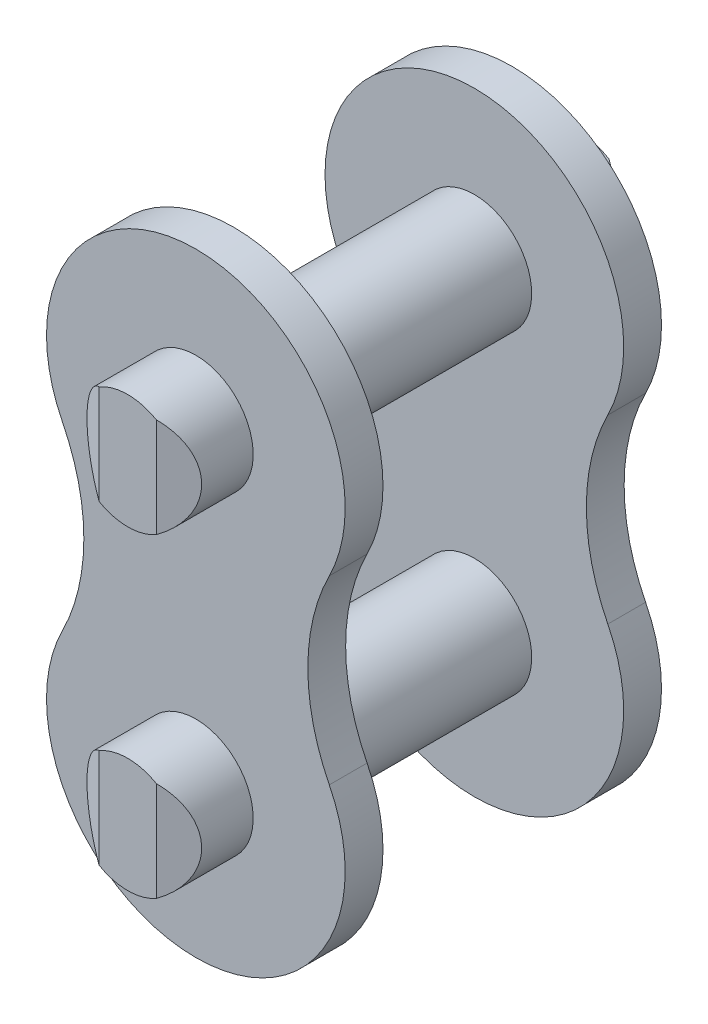
ISO-10303-21;
HEADER;
FILE_DESCRIPTION(('STEP AP214'),'2;1');
FILE_NAME('part.step','',(''),(''),'','','');
FILE_SCHEMA(('AUTOMOTIVE_DESIGN { 1 0 10303 214 1 1 1 1 }'));
ENDSEC;
DATA;
#1=APPLICATION_CONTEXT('core data for automotive mechanical design processes');
#2=APPLICATION_PROTOCOL_DEFINITION('international standard','automotive_design',2000,#1);
#3=PRODUCT_CONTEXT('',#1,'mechanical');
#4=PRODUCT('Part','Part','',(#3));
#5=PRODUCT_RELATED_PRODUCT_CATEGORY('part','',(#4));
#6=PRODUCT_DEFINITION_FORMATION('','',#4);
#7=PRODUCT_DEFINITION_CONTEXT('part definition',#1,'design');
#8=PRODUCT_DEFINITION('design','',#6,#7);
#9=PRODUCT_DEFINITION_SHAPE('','',#8);
#10=(LENGTH_UNIT() NAMED_UNIT(*) SI_UNIT(.MILLI.,.METRE.));
#11=(NAMED_UNIT(*) PLANE_ANGLE_UNIT() SI_UNIT($,.RADIAN.));
#12=(NAMED_UNIT(*) SI_UNIT($,.STERADIAN.) SOLID_ANGLE_UNIT());
#13=UNCERTAINTY_MEASURE_WITH_UNIT(LENGTH_MEASURE(1.E-05),#10,'distance_accuracy_value','');
#14=(GEOMETRIC_REPRESENTATION_CONTEXT(3) GLOBAL_UNCERTAINTY_ASSIGNED_CONTEXT((#13)) GLOBAL_UNIT_ASSIGNED_CONTEXT((#10,
#11,#12)) REPRESENTATION_CONTEXT('',''));
#15=CARTESIAN_POINT('',(0.,0.,0.));
#16=DIRECTION('',(0.,0.,1.));
#17=DIRECTION('',(1.,0.,0.));
#18=AXIS2_PLACEMENT_3D('',#15,#16,#17);
#19=CARTESIAN_POINT('',(81.9245250000066,235.985455423137,-131.392489073474));
#20=DIRECTION('',(0.5,0.,0.866025403784439));
#21=DIRECTION('',(0.,-1.,0.));
#22=AXIS2_PLACEMENT_3D('',#19,#20,#21);
#23=PLANE('',#22);
#24=CARTESIAN_POINT('',(82.7913000000066,250.488114274086,-131.892921853051));
#25=DIRECTION('',(-0.5,0.,-0.866025403784439));
#26=DIRECTION('',(-0.866025403784439,0.,0.5));
#27=AXIS2_PLACEMENT_3D('',#24,#25,#26);
#28=ELLIPSE('',#27,1.3344874122049,1.1557);
#29=CARTESIAN_POINT('',(82.2134500000065,249.487248714932,-131.5593));
#30=VERTEX_POINT('',#29);
#31=CARTESIAN_POINT('',(82.2134500000065,251.488979833239,-131.5593));
#32=VERTEX_POINT('',#31);
#33=EDGE_CURVE('E262',#30,#32,#28,.T.);
#34=ORIENTED_EDGE('',*,*,#33,.T.);
#35=DIRECTION('',(0.,1.,0.));
#36=VECTOR('',#35,1.);
#37=CARTESIAN_POINT('',(82.2134500000065,235.985455423137,-131.5593));
#38=LINE('',#37,#36);
#39=EDGE_CURVE('E270',#30,#32,#38,.T.);
#40=ORIENTED_EDGE('',*,*,#39,.F.);
#41=EDGE_LOOP('',(#34,#40));
#42=FACE_BOUND('',#41,.T.);
#43=ADVANCED_FACE('F17',(#42),#23,.F.);
#44=CARTESIAN_POINT('',(83.6580750000066,235.985455423137,-131.392489073474));
#45=DIRECTION('',(0.5,0.,-0.866025403784439));
#46=DIRECTION('',(0.,-1.,0.));
#47=AXIS2_PLACEMENT_3D('',#44,#45,#46);
#48=PLANE('',#47);
#49=CARTESIAN_POINT('',(82.7913000000066,250.488114274086,-131.892921853051));
#50=DIRECTION('',(-0.5,0.,0.866025403784439));
#51=DIRECTION('',(0.866025403784439,0.,0.5));
#52=AXIS2_PLACEMENT_3D('',#49,#50,#51);
#53=ELLIPSE('',#52,1.3344874122049,1.1557);
#54=CARTESIAN_POINT('',(83.3691500000066,249.487248714932,-131.5593));
#55=VERTEX_POINT('',#54);
#56=CARTESIAN_POINT('',(83.3691500000066,251.488979833239,-131.5593));
#57=VERTEX_POINT('',#56);
#58=EDGE_CURVE('E261',#55,#57,#53,.T.);
#59=ORIENTED_EDGE('',*,*,#58,.F.);
#60=DIRECTION('',(0.,1.,0.));
#61=VECTOR('',#60,1.);
#62=CARTESIAN_POINT('',(83.3691500000066,235.985455423137,-131.5593));
#63=LINE('',#62,#61);
#64=EDGE_CURVE('E304',#55,#57,#63,.T.);
#65=ORIENTED_EDGE('',*,*,#64,.T.);
#66=EDGE_LOOP('',(#59,#65));
#67=FACE_BOUND('',#66,.T.);
#68=ADVANCED_FACE('F19',(#67),#48,.T.);
#69=CARTESIAN_POINT('',(81.9245250000066,235.985455423137,-131.392489073474));
#70=DIRECTION('',(0.5,0.,0.866025403784439));
#71=DIRECTION('',(0.,-1.,0.));
#72=AXIS2_PLACEMENT_3D('',#69,#70,#71);
#73=PLANE('',#72);
#74=CARTESIAN_POINT('',(82.7913000000066,256.838114274086,-131.892921853051));
#75=DIRECTION('',(-0.5,0.,-0.866025403784439));
#76=DIRECTION('',(-0.866025403784439,0.,0.5));
#77=AXIS2_PLACEMENT_3D('',#74,#75,#76);
#78=ELLIPSE('',#77,1.3344874122049,1.1557);
#79=CARTESIAN_POINT('',(82.2134500000065,255.837248714932,-131.5593));
#80=VERTEX_POINT('',#79);
#81=CARTESIAN_POINT('',(82.2134500000065,257.83897983324,-131.5593));
#82=VERTEX_POINT('',#81);
#83=EDGE_CURVE('E310',#80,#82,#78,.T.);
#84=ORIENTED_EDGE('',*,*,#83,.T.);
#85=DIRECTION('',(0.,1.,0.));
#86=VECTOR('',#85,1.);
#87=CARTESIAN_POINT('',(82.2134500000065,235.985455423137,-131.5593));
#88=LINE('',#87,#86);
#89=EDGE_CURVE('E315',#80,#82,#88,.T.);
#90=ORIENTED_EDGE('',*,*,#89,.F.);
#91=EDGE_LOOP('',(#84,#90));
#92=FACE_BOUND('',#91,.T.);
#93=ADVANCED_FACE('F415',(#92),#73,.F.);
#94=CARTESIAN_POINT('',(83.6580750000066,235.985455423137,-131.392489073474));
#95=DIRECTION('',(0.5,0.,-0.866025403784439));
#96=DIRECTION('',(0.,-1.,0.));
#97=AXIS2_PLACEMENT_3D('',#94,#95,#96);
#98=PLANE('',#97);
#99=CARTESIAN_POINT('',(82.7913000000066,256.838114274086,-131.892921853051));
#100=DIRECTION('',(-0.5,0.,0.866025403784439));
#101=DIRECTION('',(0.866025403784439,0.,0.5));
#102=AXIS2_PLACEMENT_3D('',#99,#100,#101);
#103=ELLIPSE('',#102,1.3344874122049,1.1557);
#104=CARTESIAN_POINT('',(83.3691500000066,255.837248714932,-131.5593));
#105=VERTEX_POINT('',#104);
#106=CARTESIAN_POINT('',(83.3691500000066,257.83897983324,-131.5593));
#107=VERTEX_POINT('',#106);
#108=EDGE_CURVE('E236',#105,#107,#103,.T.);
#109=ORIENTED_EDGE('',*,*,#108,.F.);
#110=DIRECTION('',(0.,1.,0.));
#111=VECTOR('',#110,1.);
#112=CARTESIAN_POINT('',(83.3691500000066,235.985455423137,-131.5593));
#113=LINE('',#112,#111);
#114=EDGE_CURVE('E291',#105,#107,#113,.T.);
#115=ORIENTED_EDGE('',*,*,#114,.T.);
#116=EDGE_LOOP('',(#109,#115));
#117=FACE_BOUND('',#116,.T.);
#118=ADVANCED_FACE('F411',(#117),#98,.T.);
#119=CARTESIAN_POINT('',(82.7913000000066,253.663114274086,-129.4257));
#120=DIRECTION('',(0.,0.,-1.));
#121=DIRECTION('',(0.,-1.,0.));
#122=AXIS2_PLACEMENT_3D('',#119,#120,#121);
#123=PLANE('',#122);
#124=CARTESIAN_POINT('',(82.7913000000066,250.488114274086,-129.4257));
#125=DIRECTION('',(0.,0.,1.));
#126=DIRECTION('',(0.,1.,0.));
#127=AXIS2_PLACEMENT_3D('',#124,#125,#126);
#128=CIRCLE('',#127,1.1557);
#129=CARTESIAN_POINT('',(82.7913000000066,251.643814274086,-129.4257));
#130=VERTEX_POINT('',#129);
#131=EDGE_CURVE('E279',#130,#130,#128,.T.);
#132=ORIENTED_EDGE('',*,*,#131,.F.);
#133=EDGE_LOOP('',(#132));
#134=FACE_BOUND('',#133,.T.);
#135=CARTESIAN_POINT('',(82.7913000000066,256.838114274086,-129.4257));
#136=DIRECTION('',(0.,0.,1.));
#137=DIRECTION('',(0.,1.,0.));
#138=AXIS2_PLACEMENT_3D('',#135,#136,#137);
#139=CIRCLE('',#138,1.1557);
#140=CARTESIAN_POINT('',(82.7913000000066,257.993814274086,-129.4257));
#141=VERTEX_POINT('',#140);
#142=EDGE_CURVE('E285',#141,#141,#139,.T.);
#143=ORIENTED_EDGE('',*,*,#142,.F.);
#144=EDGE_LOOP('',(#143));
#145=FACE_BOUND('',#144,.T.);
#146=CARTESIAN_POINT('',(89.1133747362935,253.663114274086,-129.4257));
#147=DIRECTION('',(0.,0.,1.));
#148=DIRECTION('',(0.,1.,0.));
#149=AXIS2_PLACEMENT_3D('',#146,#147,#148);
#150=CIRCLE('',#149,4.06464973628698);
#151=CARTESIAN_POINT('',(85.4810560209653,255.487295797118,-129.4257));
#152=VERTEX_POINT('',#151);
#153=CARTESIAN_POINT('',(85.4810560209653,251.838932751053,-129.4257));
#154=VERTEX_POINT('',#153);
#155=EDGE_CURVE('E286',#152,#154,#150,.T.);
#156=ORIENTED_EDGE('',*,*,#155,.F.);
#157=CARTESIAN_POINT('',(82.7913000000066,256.838114274086,-129.4257));
#158=DIRECTION('',(0.,0.,1.));
#159=DIRECTION('',(0.,1.,0.));
#160=AXIS2_PLACEMENT_3D('',#157,#158,#159);
#161=CIRCLE('',#160,3.0099);
#162=CARTESIAN_POINT('',(80.1015439790478,255.487295797118,-129.4257));
#163=VERTEX_POINT('',#162);
#164=EDGE_CURVE('E330',#152,#163,#161,.T.);
#165=ORIENTED_EDGE('',*,*,#164,.T.);
#166=CARTESIAN_POINT('',(76.4692252637197,253.663114274086,-129.4257));
#167=DIRECTION('',(0.,0.,1.));
#168=DIRECTION('',(0.,1.,0.));
#169=AXIS2_PLACEMENT_3D('',#166,#167,#168);
#170=CIRCLE('',#169,4.06464973628691);
#171=CARTESIAN_POINT('',(80.1015439790478,251.838932751053,-129.4257));
#172=VERTEX_POINT('',#171);
#173=EDGE_CURVE('E339',#172,#163,#170,.T.);
#174=ORIENTED_EDGE('',*,*,#173,.F.);
#175=CARTESIAN_POINT('',(82.7913000000065,250.488114274086,-129.4257));
#176=DIRECTION('',(0.,0.,1.));
#177=DIRECTION('',(0.,1.,0.));
#178=AXIS2_PLACEMENT_3D('',#175,#176,#177);
#179=CIRCLE('',#178,3.0099);
#180=EDGE_CURVE('E26',#172,#154,#179,.T.);
#181=ORIENTED_EDGE('',*,*,#180,.T.);
#182=EDGE_LOOP('',(#156,#165,#174,#181));
#183=FACE_BOUND('',#182,.T.);
#184=ADVANCED_FACE('F354',(#134,#145,#183),#123,.F.);
#185=CARTESIAN_POINT('',(82.7913000000066,253.663114274086,-130.1877));
#186=DIRECTION('',(0.,0.,-1.));
#187=DIRECTION('',(0.,-1.,0.));
#188=AXIS2_PLACEMENT_3D('',#185,#186,#187);
#189=PLANE('',#188);
#190=CARTESIAN_POINT('',(82.7913000000066,250.488114274086,-130.1877));
#191=DIRECTION('',(0.,0.,1.));
#192=DIRECTION('',(0.,1.,0.));
#193=AXIS2_PLACEMENT_3D('',#190,#191,#192);
#194=CIRCLE('',#193,1.1557);
#195=CARTESIAN_POINT('',(82.7913000000066,251.643814274086,-130.1877));
#196=VERTEX_POINT('',#195);
#197=EDGE_CURVE('E276',#196,#196,#194,.T.);
#198=ORIENTED_EDGE('',*,*,#197,.T.);
#199=EDGE_LOOP('',(#198));
#200=FACE_BOUND('',#199,.T.);
#201=CARTESIAN_POINT('',(82.7913000000066,256.838114274086,-130.1877));
#202=DIRECTION('',(0.,0.,1.));
#203=DIRECTION('',(0.,1.,0.));
#204=AXIS2_PLACEMENT_3D('',#201,#202,#203);
#205=CIRCLE('',#204,1.1557);
#206=CARTESIAN_POINT('',(82.7913000000066,257.993814274086,-130.1877));
#207=VERTEX_POINT('',#206);
#208=EDGE_CURVE('E307',#207,#207,#205,.T.);
#209=ORIENTED_EDGE('',*,*,#208,.T.);
#210=EDGE_LOOP('',(#209));
#211=FACE_BOUND('',#210,.T.);
#212=CARTESIAN_POINT('',(89.1133747362935,253.663114274086,-130.1877));
#213=DIRECTION('',(0.,0.,1.));
#214=DIRECTION('',(0.,1.,0.));
#215=AXIS2_PLACEMENT_3D('',#212,#213,#214);
#216=CIRCLE('',#215,4.06464973628698);
#217=CARTESIAN_POINT('',(85.4810560209653,255.487295797118,-130.1877));
#218=VERTEX_POINT('',#217);
#219=CARTESIAN_POINT('',(85.4810560209653,251.838932751053,-130.1877));
#220=VERTEX_POINT('',#219);
#221=EDGE_CURVE('E323',#218,#220,#216,.T.);
#222=ORIENTED_EDGE('',*,*,#221,.T.);
#223=CARTESIAN_POINT('',(82.7913000000065,250.488114274086,-130.1877));
#224=DIRECTION('',(0.,0.,1.));
#225=DIRECTION('',(0.,1.,0.));
#226=AXIS2_PLACEMENT_3D('',#223,#224,#225);
#227=CIRCLE('',#226,3.0099);
#228=CARTESIAN_POINT('',(80.1015439790478,251.838932751053,-130.1877));
#229=VERTEX_POINT('',#228);
#230=EDGE_CURVE('E11',#229,#220,#227,.T.);
#231=ORIENTED_EDGE('',*,*,#230,.F.);
#232=CARTESIAN_POINT('',(76.4692252637197,253.663114274086,-130.1877));
#233=DIRECTION('',(0.,0.,1.));
#234=DIRECTION('',(0.,1.,0.));
#235=AXIS2_PLACEMENT_3D('',#232,#233,#234);
#236=CIRCLE('',#235,4.06464973628691);
#237=CARTESIAN_POINT('',(80.1015439790478,255.487295797118,-130.1877));
#238=VERTEX_POINT('',#237);
#239=EDGE_CURVE('E342',#229,#238,#236,.T.);
#240=ORIENTED_EDGE('',*,*,#239,.T.);
#241=CARTESIAN_POINT('',(82.7913000000066,256.838114274086,-130.1877));
#242=DIRECTION('',(0.,0.,1.));
#243=DIRECTION('',(0.,1.,0.));
#244=AXIS2_PLACEMENT_3D('',#241,#242,#243);
#245=CIRCLE('',#244,3.0099);
#246=EDGE_CURVE('E331',#218,#238,#245,.T.);
#247=ORIENTED_EDGE('',*,*,#246,.F.);
#248=EDGE_LOOP('',(#222,#231,#240,#247));
#249=FACE_BOUND('',#248,.T.);
#250=ADVANCED_FACE('F515',(#200,#211,#249),#189,.T.);
#251=CARTESIAN_POINT('',(82.7913000000065,250.488114274086,-130.1877));
#252=DIRECTION('',(0.,0.,1.));
#253=DIRECTION('',(0.,-1.,0.));
#254=AXIS2_PLACEMENT_3D('',#251,#252,#253);
#255=CYLINDRICAL_SURFACE('',#254,3.0099);
#256=ORIENTED_EDGE('',*,*,#180,.F.);
#257=DIRECTION('',(0.,0.,1.));
#258=VECTOR('',#257,1.);
#259=CARTESIAN_POINT('',(80.1015439790478,251.838932751053,-130.1877));
#260=LINE('',#259,#258);
#261=EDGE_CURVE('E239',#229,#172,#260,.T.);
#262=ORIENTED_EDGE('',*,*,#261,.F.);
#263=ORIENTED_EDGE('',*,*,#230,.T.);
#264=DIRECTION('',(0.,0.,1.));
#265=VECTOR('',#264,1.);
#266=CARTESIAN_POINT('',(85.4810560209653,251.838932751053,-130.1877));
#267=LINE('',#266,#265);
#268=EDGE_CURVE('E290',#220,#154,#267,.T.);
#269=ORIENTED_EDGE('',*,*,#268,.T.);
#270=EDGE_LOOP('',(#256,#262,#263,#269));
#271=FACE_BOUND('',#270,.T.);
#272=ADVANCED_FACE('F512',(#271),#255,.T.);
#273=CARTESIAN_POINT('',(76.4692252637197,253.663114274086,-130.1877));
#274=DIRECTION('',(0.,0.,1.));
#275=DIRECTION('',(0.,-1.,0.));
#276=AXIS2_PLACEMENT_3D('',#273,#274,#275);
#277=CYLINDRICAL_SURFACE('',#276,4.06464973628691);
#278=ORIENTED_EDGE('',*,*,#173,.T.);
#279=DIRECTION('',(0.,0.,1.));
#280=VECTOR('',#279,1.);
#281=CARTESIAN_POINT('',(80.1015439790478,255.487295797118,-130.1877));
#282=LINE('',#281,#280);
#283=EDGE_CURVE('E335',#238,#163,#282,.T.);
#284=ORIENTED_EDGE('',*,*,#283,.F.);
#285=ORIENTED_EDGE('',*,*,#239,.F.);
#286=ORIENTED_EDGE('',*,*,#261,.T.);
#287=EDGE_LOOP('',(#278,#284,#285,#286));
#288=FACE_BOUND('',#287,.T.);
#289=ADVANCED_FACE('F349',(#288),#277,.F.);
#290=CARTESIAN_POINT('',(82.7913000000066,256.838114274086,-130.1877));
#291=DIRECTION('',(0.,0.,1.));
#292=DIRECTION('',(0.,-1.,0.));
#293=AXIS2_PLACEMENT_3D('',#290,#291,#292);
#294=CYLINDRICAL_SURFACE('',#293,3.0099);
#295=ORIENTED_EDGE('',*,*,#164,.F.);
#296=DIRECTION('',(0.,0.,1.));
#297=VECTOR('',#296,1.);
#298=CARTESIAN_POINT('',(85.4810560209653,255.487295797118,-130.1877));
#299=LINE('',#298,#297);
#300=EDGE_CURVE('E326',#218,#152,#299,.T.);
#301=ORIENTED_EDGE('',*,*,#300,.F.);
#302=ORIENTED_EDGE('',*,*,#246,.T.);
#303=ORIENTED_EDGE('',*,*,#283,.T.);
#304=EDGE_LOOP('',(#295,#301,#302,#303));
#305=FACE_BOUND('',#304,.T.);
#306=ADVANCED_FACE('F506',(#305),#294,.T.);
#307=CARTESIAN_POINT('',(89.1133747362935,253.663114274086,-130.1877));
#308=DIRECTION('',(0.,0.,1.));
#309=DIRECTION('',(0.,-1.,0.));
#310=AXIS2_PLACEMENT_3D('',#307,#308,#309);
#311=CYLINDRICAL_SURFACE('',#310,4.06464973628698);
#312=ORIENTED_EDGE('',*,*,#155,.T.);
#313=ORIENTED_EDGE('',*,*,#268,.F.);
#314=ORIENTED_EDGE('',*,*,#221,.F.);
#315=ORIENTED_EDGE('',*,*,#300,.T.);
#316=EDGE_LOOP('',(#312,#313,#314,#315));
#317=FACE_BOUND('',#316,.T.);
#318=ADVANCED_FACE('F503',(#317),#311,.F.);
#319=CARTESIAN_POINT('',(82.7913000000066,253.663114274086,-131.5593));
#320=DIRECTION('',(0.,0.,-1.));
#321=DIRECTION('',(0.,-1.,0.));
#322=AXIS2_PLACEMENT_3D('',#319,#320,#321);
#323=PLANE('',#322);
#324=ORIENTED_EDGE('',*,*,#89,.T.);
#325=CARTESIAN_POINT('',(82.7913000000066,256.838114274086,-131.5593));
#326=DIRECTION('',(0.,0.,1.));
#327=DIRECTION('',(0.,1.,0.));
#328=AXIS2_PLACEMENT_3D('',#325,#326,#327);
#329=CIRCLE('',#328,1.1557);
#330=EDGE_CURVE('E318',#107,#82,#329,.T.);
#331=ORIENTED_EDGE('',*,*,#330,.F.);
#332=ORIENTED_EDGE('',*,*,#114,.F.);
#333=CARTESIAN_POINT('',(82.7913000000066,256.838114274086,-131.5593));
#334=DIRECTION('',(0.,0.,1.));
#335=DIRECTION('',(0.,1.,0.));
#336=AXIS2_PLACEMENT_3D('',#333,#334,#335);
#337=CIRCLE('',#336,1.1557);
#338=EDGE_CURVE('E311',#80,#105,#337,.T.);
#339=ORIENTED_EDGE('',*,*,#338,.F.);
#340=EDGE_LOOP('',(#324,#331,#332,#339));
#341=FACE_BOUND('',#340,.T.);
#342=ADVANCED_FACE('F413',(#341),#323,.T.);
#343=CARTESIAN_POINT('',(82.7913000000066,256.838114274086,-131.5593));
#344=DIRECTION('',(0.,0.,1.));
#345=DIRECTION('',(0.,-1.,0.));
#346=AXIS2_PLACEMENT_3D('',#343,#344,#345);
#347=CYLINDRICAL_SURFACE('',#346,1.1557);
#348=ORIENTED_EDGE('',*,*,#83,.F.);
#349=ORIENTED_EDGE('',*,*,#338,.T.);
#350=ORIENTED_EDGE('',*,*,#108,.T.);
#351=ORIENTED_EDGE('',*,*,#330,.T.);
#352=EDGE_LOOP('',(#348,#349,#350,#351));
#353=FACE_BOUND('',#352,.T.);
#354=ORIENTED_EDGE('',*,*,#208,.F.);
#355=EDGE_LOOP('',(#354));
#356=FACE_BOUND('',#355,.T.);
#357=ADVANCED_FACE('F407',(#353,#356),#347,.T.);
#358=CARTESIAN_POINT('',(82.7913000000066,253.663114274086,-131.5593));
#359=DIRECTION('',(0.,0.,-1.));
#360=DIRECTION('',(0.,-1.,0.));
#361=AXIS2_PLACEMENT_3D('',#358,#359,#360);
#362=PLANE('',#361);
#363=ORIENTED_EDGE('',*,*,#39,.T.);
#364=CARTESIAN_POINT('',(82.7913000000066,250.488114274086,-131.5593));
#365=DIRECTION('',(0.,0.,1.));
#366=DIRECTION('',(0.,1.,0.));
#367=AXIS2_PLACEMENT_3D('',#364,#365,#366);
#368=CIRCLE('',#367,1.1557);
#369=EDGE_CURVE('E266',#57,#32,#368,.T.);
#370=ORIENTED_EDGE('',*,*,#369,.F.);
#371=ORIENTED_EDGE('',*,*,#64,.F.);
#372=CARTESIAN_POINT('',(82.7913000000066,250.488114274086,-131.5593));
#373=DIRECTION('',(0.,0.,1.));
#374=DIRECTION('',(0.,1.,0.));
#375=AXIS2_PLACEMENT_3D('',#372,#373,#374);
#376=CIRCLE('',#375,1.1557);
#377=EDGE_CURVE('E257',#30,#55,#376,.T.);
#378=ORIENTED_EDGE('',*,*,#377,.F.);
#379=EDGE_LOOP('',(#363,#370,#371,#378));
#380=FACE_BOUND('',#379,.T.);
#381=ADVANCED_FACE('F494',(#380),#362,.T.);
#382=CARTESIAN_POINT('',(82.7913000000066,250.488114274086,-131.5593));
#383=DIRECTION('',(0.,0.,1.));
#384=DIRECTION('',(0.,-1.,0.));
#385=AXIS2_PLACEMENT_3D('',#382,#383,#384);
#386=CYLINDRICAL_SURFACE('',#385,1.1557);
#387=ORIENTED_EDGE('',*,*,#33,.F.);
#388=ORIENTED_EDGE('',*,*,#377,.T.);
#389=ORIENTED_EDGE('',*,*,#58,.T.);
#390=ORIENTED_EDGE('',*,*,#369,.T.);
#391=EDGE_LOOP('',(#387,#388,#389,#390));
#392=FACE_BOUND('',#391,.T.);
#393=ORIENTED_EDGE('',*,*,#197,.F.);
#394=EDGE_LOOP('',(#393));
#395=FACE_BOUND('',#394,.T.);
#396=ADVANCED_FACE('F490',(#392,#395),#386,.T.);
#397=CARTESIAN_POINT('',(81.9245250000066,235.985455423137,-122.607510926526));
#398=DIRECTION('',(0.5,0.,-0.866025403784439));
#399=DIRECTION('',(0.,-1.,0.));
#400=AXIS2_PLACEMENT_3D('',#397,#398,#399);
#401=PLANE('',#400);
#402=CARTESIAN_POINT('',(82.7913000000066,250.488114274086,-122.107078146949));
#403=DIRECTION('',(0.5,0.,-0.866025403784439));
#404=DIRECTION('',(-0.866025403784439,0.,-0.5));
#405=AXIS2_PLACEMENT_3D('',#402,#403,#404);
#406=ELLIPSE('',#405,1.3344874122049,1.1557);
#407=CARTESIAN_POINT('',(82.2134500000065,249.487248714932,-122.4407));
#408=VERTEX_POINT('',#407);
#409=CARTESIAN_POINT('',(82.2134500000065,251.488979833239,-122.4407));
#410=VERTEX_POINT('',#409);
#411=EDGE_CURVE('E370',#408,#410,#406,.T.);
#412=ORIENTED_EDGE('',*,*,#411,.F.);
#413=DIRECTION('',(0.,1.,0.));
#414=VECTOR('',#413,1.);
#415=CARTESIAN_POINT('',(82.2134500000065,235.985455423137,-122.4407));
#416=LINE('',#415,#414);
#417=EDGE_CURVE('E371',#408,#410,#416,.T.);
#418=ORIENTED_EDGE('',*,*,#417,.T.);
#419=EDGE_LOOP('',(#412,#418));
#420=FACE_BOUND('',#419,.T.);
#421=ADVANCED_FACE('F493',(#420),#401,.F.);
#422=CARTESIAN_POINT('',(83.6580750000066,235.985455423137,-122.607510926526));
#423=DIRECTION('',(0.5,0.,0.866025403784439));
#424=DIRECTION('',(0.,-1.,0.));
#425=AXIS2_PLACEMENT_3D('',#422,#423,#424);
#426=PLANE('',#425);
#427=CARTESIAN_POINT('',(82.7913000000066,250.488114274086,-122.107078146949));
#428=DIRECTION('',(0.5,0.,0.866025403784439));
#429=DIRECTION('',(0.866025403784439,0.,-0.5));
#430=AXIS2_PLACEMENT_3D('',#427,#428,#429);
#431=ELLIPSE('',#430,1.3344874122049,1.1557);
#432=CARTESIAN_POINT('',(83.3691500000066,249.487248714932,-122.4407));
#433=VERTEX_POINT('',#432);
#434=CARTESIAN_POINT('',(83.3691500000066,251.488979833239,-122.4407));
#435=VERTEX_POINT('',#434);
#436=EDGE_CURVE('E369',#433,#435,#431,.T.);
#437=ORIENTED_EDGE('',*,*,#436,.T.);
#438=DIRECTION('',(0.,1.,0.));
#439=VECTOR('',#438,1.);
#440=CARTESIAN_POINT('',(83.3691500000066,235.985455423137,-122.4407));
#441=LINE('',#440,#439);
#442=EDGE_CURVE('E374',#433,#435,#441,.T.);
#443=ORIENTED_EDGE('',*,*,#442,.F.);
#444=EDGE_LOOP('',(#437,#443));
#445=FACE_BOUND('',#444,.T.);
#446=ADVANCED_FACE('F481',(#445),#426,.T.);
#447=CARTESIAN_POINT('',(81.9245250000066,235.985455423137,-122.607510926526));
#448=DIRECTION('',(0.5,0.,-0.866025403784439));
#449=DIRECTION('',(0.,-1.,0.));
#450=AXIS2_PLACEMENT_3D('',#447,#448,#449);
#451=PLANE('',#450);
#452=CARTESIAN_POINT('',(82.7913000000066,256.838114274086,-122.107078146949));
#453=DIRECTION('',(0.5,0.,-0.866025403784439));
#454=DIRECTION('',(-0.866025403784439,0.,-0.5));
#455=AXIS2_PLACEMENT_3D('',#452,#453,#454);
#456=ELLIPSE('',#455,1.3344874122049,1.1557);
#457=CARTESIAN_POINT('',(82.2134500000065,255.837248714932,-122.4407));
#458=VERTEX_POINT('',#457);
#459=CARTESIAN_POINT('',(82.2134500000065,257.83897983324,-122.4407));
#460=VERTEX_POINT('',#459);
#461=EDGE_CURVE('E382',#458,#460,#456,.T.);
#462=ORIENTED_EDGE('',*,*,#461,.F.);
#463=DIRECTION('',(0.,1.,0.));
#464=VECTOR('',#463,1.);
#465=CARTESIAN_POINT('',(82.2134500000065,235.985455423137,-122.4407));
#466=LINE('',#465,#464);
#467=EDGE_CURVE('E241',#458,#460,#466,.T.);
#468=ORIENTED_EDGE('',*,*,#467,.T.);
#469=EDGE_LOOP('',(#462,#468));
#470=FACE_BOUND('',#469,.T.);
#471=ADVANCED_FACE('F477',(#470),#451,.F.);
#472=CARTESIAN_POINT('',(83.6580750000066,235.985455423137,-122.607510926526));
#473=DIRECTION('',(0.5,0.,0.866025403784439));
#474=DIRECTION('',(0.,-1.,0.));
#475=AXIS2_PLACEMENT_3D('',#472,#473,#474);
#476=PLANE('',#475);
#477=CARTESIAN_POINT('',(82.7913000000066,256.838114274086,-122.107078146949));
#478=DIRECTION('',(0.5,0.,0.866025403784439));
#479=DIRECTION('',(0.866025403784439,0.,-0.5));
#480=AXIS2_PLACEMENT_3D('',#477,#478,#479);
#481=ELLIPSE('',#480,1.3344874122049,1.1557);
#482=CARTESIAN_POINT('',(83.3691500000066,255.837248714932,-122.4407));
#483=VERTEX_POINT('',#482);
#484=CARTESIAN_POINT('',(83.3691500000066,257.83897983324,-122.4407));
#485=VERTEX_POINT('',#484);
#486=EDGE_CURVE('E392',#483,#485,#481,.T.);
#487=ORIENTED_EDGE('',*,*,#486,.T.);
#488=DIRECTION('',(0.,1.,0.));
#489=VECTOR('',#488,1.);
#490=CARTESIAN_POINT('',(83.3691500000066,235.985455423137,-122.4407));
#491=LINE('',#490,#489);
#492=EDGE_CURVE('E232',#483,#485,#491,.T.);
#493=ORIENTED_EDGE('',*,*,#492,.F.);
#494=EDGE_LOOP('',(#487,#493));
#495=FACE_BOUND('',#494,.T.);
#496=ADVANCED_FACE('F480',(#495),#476,.T.);
#497=CARTESIAN_POINT('',(82.7913000000066,250.488114274086,-122.4407));
#498=DIRECTION('',(0.,0.,-1.));
#499=DIRECTION('',(0.,-1.,0.));
#500=AXIS2_PLACEMENT_3D('',#497,#498,#499);
#501=CYLINDRICAL_SURFACE('',#500,1.1557);
#502=ORIENTED_EDGE('',*,*,#131,.T.);
#503=EDGE_LOOP('',(#502));
#504=FACE_BOUND('',#503,.T.);
#505=CARTESIAN_POINT('',(82.7913000000066,250.488114274086,-124.5743));
#506=DIRECTION('',(0.,0.,1.));
#507=DIRECTION('',(0.,1.,0.));
#508=AXIS2_PLACEMENT_3D('',#505,#506,#507);
#509=CIRCLE('',#508,1.1557);
#510=CARTESIAN_POINT('',(82.7913000000066,251.643814274086,-124.5743));
#511=VERTEX_POINT('',#510);
#512=EDGE_CURVE('E282',#511,#511,#509,.T.);
#513=ORIENTED_EDGE('',*,*,#512,.F.);
#514=EDGE_LOOP('',(#513));
#515=FACE_BOUND('',#514,.T.);
#516=ADVANCED_FACE('F483',(#504,#515),#501,.T.);
#517=CARTESIAN_POINT('',(82.7913000000066,256.838114274086,-122.4407));
#518=DIRECTION('',(0.,0.,-1.));
#519=DIRECTION('',(0.,-1.,0.));
#520=AXIS2_PLACEMENT_3D('',#517,#518,#519);
#521=CYLINDRICAL_SURFACE('',#520,1.1557);
#522=ORIENTED_EDGE('',*,*,#142,.T.);
#523=EDGE_LOOP('',(#522));
#524=FACE_BOUND('',#523,.T.);
#525=CARTESIAN_POINT('',(82.7913000000066,256.838114274086,-124.5743));
#526=DIRECTION('',(0.,0.,1.));
#527=DIRECTION('',(0.,1.,0.));
#528=AXIS2_PLACEMENT_3D('',#525,#526,#527);
#529=CIRCLE('',#528,1.1557);
#530=CARTESIAN_POINT('',(82.7913000000066,257.993814274086,-124.5743));
#531=VERTEX_POINT('',#530);
#532=EDGE_CURVE('E275',#531,#531,#529,.T.);
#533=ORIENTED_EDGE('',*,*,#532,.F.);
#534=EDGE_LOOP('',(#533));
#535=FACE_BOUND('',#534,.T.);
#536=ADVANCED_FACE('F475',(#524,#535),#521,.T.);
#537=CARTESIAN_POINT('',(82.7913000000066,253.663114274086,-124.5743));
#538=DIRECTION('',(0.,0.,1.));
#539=DIRECTION('',(1.,0.,0.));
#540=AXIS2_PLACEMENT_3D('',#537,#538,#539);
#541=PLANE('',#540);
#542=ORIENTED_EDGE('',*,*,#512,.T.);
#543=EDGE_LOOP('',(#542));
#544=FACE_BOUND('',#543,.T.);
#545=ORIENTED_EDGE('',*,*,#532,.T.);
#546=EDGE_LOOP('',(#545));
#547=FACE_BOUND('',#546,.T.);
#548=CARTESIAN_POINT('',(89.1133747362935,253.663114274086,-124.5743));
#549=DIRECTION('',(0.,0.,1.));
#550=DIRECTION('',(0.,1.,0.));
#551=AXIS2_PLACEMENT_3D('',#548,#549,#550);
#552=CIRCLE('',#551,4.06464973628698);
#553=CARTESIAN_POINT('',(85.4810560209653,255.487295797118,-124.5743));
#554=VERTEX_POINT('',#553);
#555=CARTESIAN_POINT('',(85.4810560209653,251.838932751053,-124.5743));
#556=VERTEX_POINT('',#555);
#557=EDGE_CURVE('E225',#554,#556,#552,.T.);
#558=ORIENTED_EDGE('',*,*,#557,.T.);
#559=CARTESIAN_POINT('',(82.7913000000065,250.488114274086,-124.5743));
#560=DIRECTION('',(0.,0.,1.));
#561=DIRECTION('',(0.,1.,0.));
#562=AXIS2_PLACEMENT_3D('',#559,#560,#561);
#563=CIRCLE('',#562,3.0099);
#564=CARTESIAN_POINT('',(80.1015439790478,251.838932751053,-124.5743));
#565=VERTEX_POINT('',#564);
#566=EDGE_CURVE('E265',#565,#556,#563,.T.);
#567=ORIENTED_EDGE('',*,*,#566,.F.);
#568=CARTESIAN_POINT('',(76.4692252637197,253.663114274086,-124.5743));
#569=DIRECTION('',(0.,0.,1.));
#570=DIRECTION('',(0.,1.,0.));
#571=AXIS2_PLACEMENT_3D('',#568,#569,#570);
#572=CIRCLE('',#571,4.06464973628691);
#573=CARTESIAN_POINT('',(80.1015439790478,255.487295797118,-124.5743));
#574=VERTEX_POINT('',#573);
#575=EDGE_CURVE('E211',#565,#574,#572,.T.);
#576=ORIENTED_EDGE('',*,*,#575,.T.);
#577=CARTESIAN_POINT('',(82.7913000000066,256.838114274086,-124.5743));
#578=DIRECTION('',(0.,0.,1.));
#579=DIRECTION('',(0.,1.,0.));
#580=AXIS2_PLACEMENT_3D('',#577,#578,#579);
#581=CIRCLE('',#580,3.0099);
#582=EDGE_CURVE('E245',#554,#574,#581,.T.);
#583=ORIENTED_EDGE('',*,*,#582,.F.);
#584=EDGE_LOOP('',(#558,#567,#576,#583));
#585=FACE_BOUND('',#584,.T.);
#586=ADVANCED_FACE('F435',(#544,#547,#585),#541,.F.);
#587=CARTESIAN_POINT('',(82.7913000000066,253.663114274086,-123.8123));
#588=DIRECTION('',(0.,0.,1.));
#589=DIRECTION('',(1.,0.,0.));
#590=AXIS2_PLACEMENT_3D('',#587,#588,#589);
#591=PLANE('',#590);
#592=CARTESIAN_POINT('',(82.7913000000066,250.488114274086,-123.8123));
#593=DIRECTION('',(0.,0.,1.));
#594=DIRECTION('',(0.,1.,0.));
#595=AXIS2_PLACEMENT_3D('',#592,#593,#594);
#596=CIRCLE('',#595,1.1557);
#597=CARTESIAN_POINT('',(82.7913000000066,251.643814274086,-123.8123));
#598=VERTEX_POINT('',#597);
#599=EDGE_CURVE('E422',#598,#598,#596,.T.);
#600=ORIENTED_EDGE('',*,*,#599,.F.);
#601=EDGE_LOOP('',(#600));
#602=FACE_BOUND('',#601,.T.);
#603=CARTESIAN_POINT('',(82.7913000000066,256.838114274086,-123.8123));
#604=DIRECTION('',(0.,0.,1.));
#605=DIRECTION('',(0.,1.,0.));
#606=AXIS2_PLACEMENT_3D('',#603,#604,#605);
#607=CIRCLE('',#606,1.1557);
#608=CARTESIAN_POINT('',(82.7913000000066,257.993814274086,-123.8123));
#609=VERTEX_POINT('',#608);
#610=EDGE_CURVE('E381',#609,#609,#607,.T.);
#611=ORIENTED_EDGE('',*,*,#610,.F.);
#612=EDGE_LOOP('',(#611));
#613=FACE_BOUND('',#612,.T.);
#614=CARTESIAN_POINT('',(89.1133747362935,253.663114274086,-123.8123));
#615=DIRECTION('',(0.,0.,1.));
#616=DIRECTION('',(0.,1.,0.));
#617=AXIS2_PLACEMENT_3D('',#614,#615,#616);
#618=CIRCLE('',#617,4.06464973628698);
#619=CARTESIAN_POINT('',(85.4810560209653,255.487295797118,-123.8123));
#620=VERTEX_POINT('',#619);
#621=CARTESIAN_POINT('',(85.4810560209653,251.838932751053,-123.8123));
#622=VERTEX_POINT('',#621);
#623=EDGE_CURVE('E214',#620,#622,#618,.T.);
#624=ORIENTED_EDGE('',*,*,#623,.F.);
#625=CARTESIAN_POINT('',(82.7913000000066,256.838114274086,-123.8123));
#626=DIRECTION('',(0.,0.,1.));
#627=DIRECTION('',(0.,1.,0.));
#628=AXIS2_PLACEMENT_3D('',#625,#626,#627);
#629=CIRCLE('',#628,3.0099);
#630=CARTESIAN_POINT('',(80.1015439790478,255.487295797118,-123.8123));
#631=VERTEX_POINT('',#630);
#632=EDGE_CURVE('E199',#620,#631,#629,.T.);
#633=ORIENTED_EDGE('',*,*,#632,.T.);
#634=CARTESIAN_POINT('',(76.4692252637197,253.663114274086,-123.8123));
#635=DIRECTION('',(0.,0.,1.));
#636=DIRECTION('',(0.,1.,0.));
#637=AXIS2_PLACEMENT_3D('',#634,#635,#636);
#638=CIRCLE('',#637,4.06464973628691);
#639=CARTESIAN_POINT('',(80.1015439790478,251.838932751053,-123.8123));
#640=VERTEX_POINT('',#639);
#641=EDGE_CURVE('E256',#640,#631,#638,.T.);
#642=ORIENTED_EDGE('',*,*,#641,.F.);
#643=CARTESIAN_POINT('',(82.7913000000065,250.488114274086,-123.8123));
#644=DIRECTION('',(0.,0.,1.));
#645=DIRECTION('',(0.,1.,0.));
#646=AXIS2_PLACEMENT_3D('',#643,#644,#645);
#647=CIRCLE('',#646,3.0099);
#648=EDGE_CURVE('E216',#640,#622,#647,.T.);
#649=ORIENTED_EDGE('',*,*,#648,.T.);
#650=EDGE_LOOP('',(#624,#633,#642,#649));
#651=FACE_BOUND('',#650,.T.);
#652=ADVANCED_FACE('F215',(#602,#613,#651),#591,.T.);
#653=CARTESIAN_POINT('',(82.7913000000065,250.488114274086,-123.8123));
#654=DIRECTION('',(0.,0.,-1.));
#655=DIRECTION('',(0.,-1.,0.));
#656=AXIS2_PLACEMENT_3D('',#653,#654,#655);
#657=CYLINDRICAL_SURFACE('',#656,3.0099);
#658=ORIENTED_EDGE('',*,*,#566,.T.);
#659=DIRECTION('',(0.,0.,-1.));
#660=VECTOR('',#659,1.);
#661=CARTESIAN_POINT('',(85.4810560209653,251.838932751053,-123.8123));
#662=LINE('',#661,#660);
#663=EDGE_CURVE('E221',#622,#556,#662,.T.);
#664=ORIENTED_EDGE('',*,*,#663,.F.);
#665=ORIENTED_EDGE('',*,*,#648,.F.);
#666=DIRECTION('',(0.,0.,-1.));
#667=VECTOR('',#666,1.);
#668=CARTESIAN_POINT('',(80.1015439790478,251.838932751053,-123.8123));
#669=LINE('',#668,#667);
#670=EDGE_CURVE('E252',#640,#565,#669,.T.);
#671=ORIENTED_EDGE('',*,*,#670,.T.);
#672=EDGE_LOOP('',(#658,#664,#665,#671));
#673=FACE_BOUND('',#672,.T.);
#674=ADVANCED_FACE('F434',(#673),#657,.T.);
#675=CARTESIAN_POINT('',(76.4692252637197,253.663114274086,-123.8123));
#676=DIRECTION('',(0.,0.,-1.));
#677=DIRECTION('',(0.,-1.,0.));
#678=AXIS2_PLACEMENT_3D('',#675,#676,#677);
#679=CYLINDRICAL_SURFACE('',#678,4.06464973628691);
#680=ORIENTED_EDGE('',*,*,#575,.F.);
#681=ORIENTED_EDGE('',*,*,#670,.F.);
#682=ORIENTED_EDGE('',*,*,#641,.T.);
#683=DIRECTION('',(0.,0.,-1.));
#684=VECTOR('',#683,1.);
#685=CARTESIAN_POINT('',(80.1015439790478,255.487295797118,-123.8123));
#686=LINE('',#685,#684);
#687=EDGE_CURVE('E207',#631,#574,#686,.T.);
#688=ORIENTED_EDGE('',*,*,#687,.T.);
#689=EDGE_LOOP('',(#680,#681,#682,#688));
#690=FACE_BOUND('',#689,.T.);
#691=ADVANCED_FACE('F466',(#690),#679,.F.);
#692=CARTESIAN_POINT('',(82.7913000000066,256.838114274086,-123.8123));
#693=DIRECTION('',(0.,0.,-1.));
#694=DIRECTION('',(0.,-1.,0.));
#695=AXIS2_PLACEMENT_3D('',#692,#693,#694);
#696=CYLINDRICAL_SURFACE('',#695,3.0099);
#697=ORIENTED_EDGE('',*,*,#582,.T.);
#698=ORIENTED_EDGE('',*,*,#687,.F.);
#699=ORIENTED_EDGE('',*,*,#632,.F.);
#700=DIRECTION('',(0.,0.,-1.));
#701=VECTOR('',#700,1.);
#702=CARTESIAN_POINT('',(85.4810560209653,255.487295797118,-123.8123));
#703=LINE('',#702,#701);
#704=EDGE_CURVE('E204',#620,#554,#703,.T.);
#705=ORIENTED_EDGE('',*,*,#704,.T.);
#706=EDGE_LOOP('',(#697,#698,#699,#705));
#707=FACE_BOUND('',#706,.T.);
#708=ADVANCED_FACE('F202',(#707),#696,.T.);
#709=CARTESIAN_POINT('',(89.1133747362935,253.663114274086,-123.8123));
#710=DIRECTION('',(0.,0.,-1.));
#711=DIRECTION('',(0.,-1.,0.));
#712=AXIS2_PLACEMENT_3D('',#709,#710,#711);
#713=CYLINDRICAL_SURFACE('',#712,4.06464973628698);
#714=ORIENTED_EDGE('',*,*,#557,.F.);
#715=ORIENTED_EDGE('',*,*,#704,.F.);
#716=ORIENTED_EDGE('',*,*,#623,.T.);
#717=ORIENTED_EDGE('',*,*,#663,.T.);
#718=EDGE_LOOP('',(#714,#715,#716,#717));
#719=FACE_BOUND('',#718,.T.);
#720=ADVANCED_FACE('F223',(#719),#713,.F.);
#721=CARTESIAN_POINT('',(82.7913000000066,253.663114274086,-122.4407));
#722=DIRECTION('',(0.,0.,1.));
#723=DIRECTION('',(1.,0.,0.));
#724=AXIS2_PLACEMENT_3D('',#721,#722,#723);
#725=PLANE('',#724);
#726=ORIENTED_EDGE('',*,*,#467,.F.);
#727=CARTESIAN_POINT('',(82.7913000000066,256.838114274086,-122.4407));
#728=DIRECTION('',(0.,0.,1.));
#729=DIRECTION('',(0.,1.,0.));
#730=AXIS2_PLACEMENT_3D('',#727,#728,#729);
#731=CIRCLE('',#730,1.1557);
#732=EDGE_CURVE('E364',#458,#483,#731,.T.);
#733=ORIENTED_EDGE('',*,*,#732,.T.);
#734=ORIENTED_EDGE('',*,*,#492,.T.);
#735=CARTESIAN_POINT('',(82.7913000000066,256.838114274086,-122.4407));
#736=DIRECTION('',(0.,0.,1.));
#737=DIRECTION('',(0.,1.,0.));
#738=AXIS2_PLACEMENT_3D('',#735,#736,#737);
#739=CIRCLE('',#738,1.1557);
#740=EDGE_CURVE('E386',#485,#460,#739,.T.);
#741=ORIENTED_EDGE('',*,*,#740,.T.);
#742=EDGE_LOOP('',(#726,#733,#734,#741));
#743=FACE_BOUND('',#742,.T.);
#744=ADVANCED_FACE('F442',(#743),#725,.T.);
#745=CARTESIAN_POINT('',(82.7913000000066,256.838114274086,-122.4407));
#746=DIRECTION('',(0.,0.,-1.));
#747=DIRECTION('',(0.,-1.,0.));
#748=AXIS2_PLACEMENT_3D('',#745,#746,#747);
#749=CYLINDRICAL_SURFACE('',#748,1.1557);
#750=ORIENTED_EDGE('',*,*,#461,.T.);
#751=ORIENTED_EDGE('',*,*,#740,.F.);
#752=ORIENTED_EDGE('',*,*,#486,.F.);
#753=ORIENTED_EDGE('',*,*,#732,.F.);
#754=EDGE_LOOP('',(#750,#751,#752,#753));
#755=FACE_BOUND('',#754,.T.);
#756=ORIENTED_EDGE('',*,*,#610,.T.);
#757=EDGE_LOOP('',(#756));
#758=FACE_BOUND('',#757,.T.);
#759=ADVANCED_FACE('F439',(#755,#758),#749,.T.);
#760=CARTESIAN_POINT('',(82.7913000000066,253.663114274086,-122.4407));
#761=DIRECTION('',(0.,0.,1.));
#762=DIRECTION('',(1.,0.,0.));
#763=AXIS2_PLACEMENT_3D('',#760,#761,#762);
#764=PLANE('',#763);
#765=ORIENTED_EDGE('',*,*,#417,.F.);
#766=CARTESIAN_POINT('',(82.7913000000066,250.488114274086,-122.4407));
#767=DIRECTION('',(0.,0.,1.));
#768=DIRECTION('',(0.,1.,0.));
#769=AXIS2_PLACEMENT_3D('',#766,#767,#768);
#770=CIRCLE('',#769,1.1557);
#771=EDGE_CURVE('E375',#408,#433,#770,.T.);
#772=ORIENTED_EDGE('',*,*,#771,.T.);
#773=ORIENTED_EDGE('',*,*,#442,.T.);
#774=CARTESIAN_POINT('',(82.7913000000066,250.488114274086,-122.4407));
#775=DIRECTION('',(0.,0.,1.));
#776=DIRECTION('',(0.,1.,0.));
#777=AXIS2_PLACEMENT_3D('',#774,#775,#776);
#778=CIRCLE('',#777,1.1557);
#779=EDGE_CURVE('E366',#435,#410,#778,.T.);
#780=ORIENTED_EDGE('',*,*,#779,.T.);
#781=EDGE_LOOP('',(#765,#772,#773,#780));
#782=FACE_BOUND('',#781,.T.);
#783=ADVANCED_FACE('F441',(#782),#764,.T.);
#784=CARTESIAN_POINT('',(82.7913000000066,250.488114274086,-122.4407));
#785=DIRECTION('',(0.,0.,-1.));
#786=DIRECTION('',(0.,-1.,0.));
#787=AXIS2_PLACEMENT_3D('',#784,#785,#786);
#788=CYLINDRICAL_SURFACE('',#787,1.1557);
#789=ORIENTED_EDGE('',*,*,#411,.T.);
#790=ORIENTED_EDGE('',*,*,#779,.F.);
#791=ORIENTED_EDGE('',*,*,#436,.F.);
#792=ORIENTED_EDGE('',*,*,#771,.F.);
#793=EDGE_LOOP('',(#789,#790,#791,#792));
#794=FACE_BOUND('',#793,.T.);
#795=ORIENTED_EDGE('',*,*,#599,.T.);
#796=EDGE_LOOP('',(#795));
#797=FACE_BOUND('',#796,.T.);
#798=ADVANCED_FACE('F430',(#794,#797),#788,.T.);
#799=CLOSED_SHELL('',(#43,#68,#93,#118,#184,#250,#272,#289,#306,#318,#342,#357,#381,#396,#421,
#446,#471,#496,#516,#536,#586,#652,#674,#691,#708,#720,#744,#759,#783,#798));
#800=MANIFOLD_SOLID_BREP('B1',#799);
#801=ADVANCED_BREP_SHAPE_REPRESENTATION('',(#18,#800),#14);
#802=SHAPE_DEFINITION_REPRESENTATION(#9,#801);
ENDSEC;
END-ISO-10303-21;
